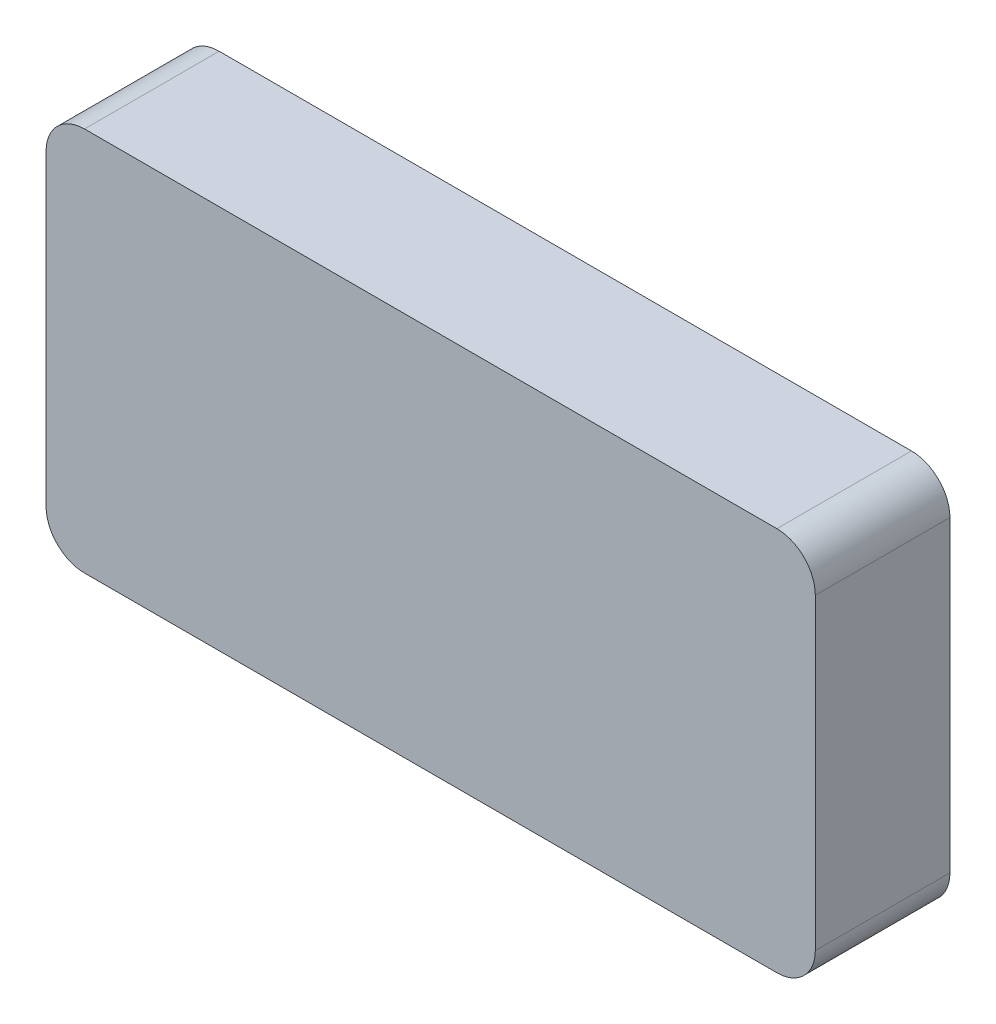
ISO-10303-21;
HEADER;
FILE_DESCRIPTION(('STEP AP214'),'2;1');
FILE_NAME('part.step','',(''),(''),'','','');
FILE_SCHEMA(('AUTOMOTIVE_DESIGN { 1 0 10303 214 1 1 1 1 }'));
ENDSEC;
DATA;
#1=APPLICATION_CONTEXT('core data for automotive mechanical design processes');
#2=APPLICATION_PROTOCOL_DEFINITION('international standard','automotive_design',2000,#1);
#3=PRODUCT_CONTEXT('',#1,'mechanical');
#4=PRODUCT('Part','Part','',(#3));
#5=PRODUCT_RELATED_PRODUCT_CATEGORY('part','',(#4));
#6=PRODUCT_DEFINITION_FORMATION('','',#4);
#7=PRODUCT_DEFINITION_CONTEXT('part definition',#1,'design');
#8=PRODUCT_DEFINITION('design','',#6,#7);
#9=PRODUCT_DEFINITION_SHAPE('','',#8);
#10=(LENGTH_UNIT() NAMED_UNIT(*) SI_UNIT(.MILLI.,.METRE.));
#11=(NAMED_UNIT(*) PLANE_ANGLE_UNIT() SI_UNIT($,.RADIAN.));
#12=(NAMED_UNIT(*) SI_UNIT($,.STERADIAN.) SOLID_ANGLE_UNIT());
#13=UNCERTAINTY_MEASURE_WITH_UNIT(LENGTH_MEASURE(1.E-05),#10,'distance_accuracy_value','');
#14=(GEOMETRIC_REPRESENTATION_CONTEXT(3) GLOBAL_UNCERTAINTY_ASSIGNED_CONTEXT((#13)) GLOBAL_UNIT_ASSIGNED_CONTEXT((#10,
#11,#12)) REPRESENTATION_CONTEXT('',''));
#15=CARTESIAN_POINT('',(0.,0.,0.));
#16=DIRECTION('',(0.,0.,1.));
#17=DIRECTION('',(1.,0.,0.));
#18=AXIS2_PLACEMENT_3D('',#15,#16,#17);
#19=CARTESIAN_POINT('',(9.,4.,3.5));
#20=DIRECTION('',(0.,0.,-1.));
#21=DIRECTION('',(-1.,0.,0.));
#22=AXIS2_PLACEMENT_3D('',#19,#20,#21);
#23=CYLINDRICAL_SURFACE('',#22,1.);
#24=CARTESIAN_POINT('',(9.,4.,0.));
#25=DIRECTION('',(0.,0.,1.));
#26=DIRECTION('',(-1.,0.,0.));
#27=AXIS2_PLACEMENT_3D('',#24,#25,#26);
#28=CIRCLE('',#27,1.);
#29=CARTESIAN_POINT('',(10.,3.99999999999999,0.));
#30=VERTEX_POINT('',#29);
#31=CARTESIAN_POINT('',(8.99999999999999,5.,0.));
#32=VERTEX_POINT('',#31);
#33=EDGE_CURVE('E144',#30,#32,#28,.T.);
#34=ORIENTED_EDGE('',*,*,#33,.T.);
#35=DIRECTION('',(0.,0.,-1.));
#36=VECTOR('',#35,1.);
#37=CARTESIAN_POINT('',(8.99999999999999,5.,3.5));
#38=LINE('',#37,#36);
#39=CARTESIAN_POINT('',(8.99999999999999,5.,3.5));
#40=VERTEX_POINT('',#39);
#41=EDGE_CURVE('E11',#40,#32,#38,.T.);
#42=ORIENTED_EDGE('',*,*,#41,.F.);
#43=CARTESIAN_POINT('',(9.,4.,3.5));
#44=DIRECTION('',(0.,0.,1.));
#45=DIRECTION('',(-1.,0.,0.));
#46=AXIS2_PLACEMENT_3D('',#43,#44,#45);
#47=CIRCLE('',#46,1.);
#48=CARTESIAN_POINT('',(10.,3.99999999999999,3.5));
#49=VERTEX_POINT('',#48);
#50=EDGE_CURVE('E160',#49,#40,#47,.T.);
#51=ORIENTED_EDGE('',*,*,#50,.F.);
#52=DIRECTION('',(0.,0.,-1.));
#53=VECTOR('',#52,1.);
#54=CARTESIAN_POINT('',(10.,3.99999999999999,3.5));
#55=LINE('',#54,#53);
#56=EDGE_CURVE('E140',#49,#30,#55,.T.);
#57=ORIENTED_EDGE('',*,*,#56,.T.);
#58=EDGE_LOOP('',(#34,#42,#51,#57));
#59=FACE_BOUND('',#58,.T.);
#60=ADVANCED_FACE('F36',(#59),#23,.T.);
#61=CARTESIAN_POINT('',(-8.99999999999999,5.,3.5));
#62=DIRECTION('',(0.,-1.,0.));
#63=DIRECTION('',(0.,0.,-1.));
#64=AXIS2_PLACEMENT_3D('',#61,#62,#63);
#65=PLANE('',#64);
#66=DIRECTION('',(-1.,0.,0.));
#67=VECTOR('',#66,1.);
#68=CARTESIAN_POINT('',(-8.99999999999999,5.,0.));
#69=LINE('',#68,#67);
#70=CARTESIAN_POINT('',(-8.99999999999999,5.,0.));
#71=VERTEX_POINT('',#70);
#72=EDGE_CURVE('E147',#32,#71,#69,.T.);
#73=ORIENTED_EDGE('',*,*,#72,.T.);
#74=DIRECTION('',(0.,0.,-1.));
#75=VECTOR('',#74,1.);
#76=CARTESIAN_POINT('',(-8.99999999999999,5.,3.5));
#77=LINE('',#76,#75);
#78=CARTESIAN_POINT('',(-8.99999999999999,5.,3.5));
#79=VERTEX_POINT('',#78);
#80=EDGE_CURVE('E43',#79,#71,#77,.T.);
#81=ORIENTED_EDGE('',*,*,#80,.F.);
#82=DIRECTION('',(-1.,0.,0.));
#83=VECTOR('',#82,1.);
#84=CARTESIAN_POINT('',(-8.99999999999999,5.,3.5));
#85=LINE('',#84,#83);
#86=EDGE_CURVE('E100',#40,#79,#85,.T.);
#87=ORIENTED_EDGE('',*,*,#86,.F.);
#88=ORIENTED_EDGE('',*,*,#41,.T.);
#89=EDGE_LOOP('',(#73,#81,#87,#88));
#90=FACE_BOUND('',#89,.T.);
#91=ADVANCED_FACE('F263',(#90),#65,.F.);
#92=CARTESIAN_POINT('',(-9.,4.,3.5));
#93=DIRECTION('',(0.,0.,-1.));
#94=DIRECTION('',(-1.,0.,0.));
#95=AXIS2_PLACEMENT_3D('',#92,#93,#94);
#96=CYLINDRICAL_SURFACE('',#95,1.);
#97=CARTESIAN_POINT('',(-9.,4.,0.));
#98=DIRECTION('',(0.,0.,1.));
#99=DIRECTION('',(1.,0.,0.));
#100=AXIS2_PLACEMENT_3D('',#97,#98,#99);
#101=CIRCLE('',#100,1.);
#102=CARTESIAN_POINT('',(-10.,3.99999999999999,0.));
#103=VERTEX_POINT('',#102);
#104=EDGE_CURVE('E150',#71,#103,#101,.T.);
#105=ORIENTED_EDGE('',*,*,#104,.T.);
#106=DIRECTION('',(0.,0.,-1.));
#107=VECTOR('',#106,1.);
#108=CARTESIAN_POINT('',(-10.,3.99999999999999,3.5));
#109=LINE('',#108,#107);
#110=CARTESIAN_POINT('',(-10.,3.99999999999999,3.5));
#111=VERTEX_POINT('',#110);
#112=EDGE_CURVE('E167',#111,#103,#109,.T.);
#113=ORIENTED_EDGE('',*,*,#112,.F.);
#114=CARTESIAN_POINT('',(-9.,4.,3.5));
#115=DIRECTION('',(0.,0.,1.));
#116=DIRECTION('',(1.,0.,0.));
#117=AXIS2_PLACEMENT_3D('',#114,#115,#116);
#118=CIRCLE('',#117,1.);
#119=EDGE_CURVE('E175',#79,#111,#118,.T.);
#120=ORIENTED_EDGE('',*,*,#119,.F.);
#121=ORIENTED_EDGE('',*,*,#80,.T.);
#122=EDGE_LOOP('',(#105,#113,#120,#121));
#123=FACE_BOUND('',#122,.T.);
#124=ADVANCED_FACE('F173',(#123),#96,.T.);
#125=CARTESIAN_POINT('',(-10.,3.99999999999999,3.5));
#126=DIRECTION('',(1.,0.,0.));
#127=DIRECTION('',(0.,0.,-1.));
#128=AXIS2_PLACEMENT_3D('',#125,#126,#127);
#129=PLANE('',#128);
#130=DIRECTION('',(0.,-1.,0.));
#131=VECTOR('',#130,1.);
#132=CARTESIAN_POINT('',(-10.,3.99999999999999,0.));
#133=LINE('',#132,#131);
#134=CARTESIAN_POINT('',(-10.,-3.99999999999999,0.));
#135=VERTEX_POINT('',#134);
#136=EDGE_CURVE('E152',#103,#135,#133,.T.);
#137=ORIENTED_EDGE('',*,*,#136,.T.);
#138=DIRECTION('',(0.,0.,-1.));
#139=VECTOR('',#138,1.);
#140=CARTESIAN_POINT('',(-10.,-3.99999999999999,3.5));
#141=LINE('',#140,#139);
#142=CARTESIAN_POINT('',(-10.,-3.99999999999999,3.5));
#143=VERTEX_POINT('',#142);
#144=EDGE_CURVE('E164',#143,#135,#141,.T.);
#145=ORIENTED_EDGE('',*,*,#144,.F.);
#146=DIRECTION('',(0.,-1.,0.));
#147=VECTOR('',#146,1.);
#148=CARTESIAN_POINT('',(-10.,3.99999999999999,3.5));
#149=LINE('',#148,#147);
#150=EDGE_CURVE('E187',#111,#143,#149,.T.);
#151=ORIENTED_EDGE('',*,*,#150,.F.);
#152=ORIENTED_EDGE('',*,*,#112,.T.);
#153=EDGE_LOOP('',(#137,#145,#151,#152));
#154=FACE_BOUND('',#153,.T.);
#155=ADVANCED_FACE('F183',(#154),#129,.F.);
#156=CARTESIAN_POINT('',(-9.,-4.,3.5));
#157=DIRECTION('',(0.,0.,-1.));
#158=DIRECTION('',(-1.,0.,0.));
#159=AXIS2_PLACEMENT_3D('',#156,#157,#158);
#160=CYLINDRICAL_SURFACE('',#159,1.);
#161=CARTESIAN_POINT('',(-9.,-4.,0.));
#162=DIRECTION('',(0.,0.,1.));
#163=DIRECTION('',(1.,0.,0.));
#164=AXIS2_PLACEMENT_3D('',#161,#162,#163);
#165=CIRCLE('',#164,1.);
#166=CARTESIAN_POINT('',(-8.99999999999999,-5.,0.));
#167=VERTEX_POINT('',#166);
#168=EDGE_CURVE('E154',#135,#167,#165,.T.);
#169=ORIENTED_EDGE('',*,*,#168,.T.);
#170=DIRECTION('',(0.,0.,-1.));
#171=VECTOR('',#170,1.);
#172=CARTESIAN_POINT('',(-8.99999999999999,-5.,3.5));
#173=LINE('',#172,#171);
#174=CARTESIAN_POINT('',(-8.99999999999999,-5.,3.5));
#175=VERTEX_POINT('',#174);
#176=EDGE_CURVE('E135',#175,#167,#173,.T.);
#177=ORIENTED_EDGE('',*,*,#176,.F.);
#178=CARTESIAN_POINT('',(-9.,-4.,3.5));
#179=DIRECTION('',(0.,0.,1.));
#180=DIRECTION('',(1.,0.,0.));
#181=AXIS2_PLACEMENT_3D('',#178,#179,#180);
#182=CIRCLE('',#181,1.);
#183=EDGE_CURVE('E123',#143,#175,#182,.T.);
#184=ORIENTED_EDGE('',*,*,#183,.F.);
#185=ORIENTED_EDGE('',*,*,#144,.T.);
#186=EDGE_LOOP('',(#169,#177,#184,#185));
#187=FACE_BOUND('',#186,.T.);
#188=ADVANCED_FACE('F186',(#187),#160,.T.);
#189=CARTESIAN_POINT('',(-8.99999999999999,-5.,3.5));
#190=DIRECTION('',(0.,1.,0.));
#191=DIRECTION('',(0.,0.,1.));
#192=AXIS2_PLACEMENT_3D('',#189,#190,#191);
#193=PLANE('',#192);
#194=DIRECTION('',(1.,0.,0.));
#195=VECTOR('',#194,1.);
#196=CARTESIAN_POINT('',(-8.99999999999999,-5.,0.));
#197=LINE('',#196,#195);
#198=CARTESIAN_POINT('',(8.99999999999999,-5.,0.));
#199=VERTEX_POINT('',#198);
#200=EDGE_CURVE('E132',#167,#199,#197,.T.);
#201=ORIENTED_EDGE('',*,*,#200,.T.);
#202=DIRECTION('',(0.,0.,-1.));
#203=VECTOR('',#202,1.);
#204=CARTESIAN_POINT('',(8.99999999999999,-5.,3.5));
#205=LINE('',#204,#203);
#206=CARTESIAN_POINT('',(8.99999999999999,-5.,3.5));
#207=VERTEX_POINT('',#206);
#208=EDGE_CURVE('E129',#207,#199,#205,.T.);
#209=ORIENTED_EDGE('',*,*,#208,.F.);
#210=DIRECTION('',(1.,0.,0.));
#211=VECTOR('',#210,1.);
#212=CARTESIAN_POINT('',(-8.99999999999999,-5.,3.5));
#213=LINE('',#212,#211);
#214=EDGE_CURVE('E116',#175,#207,#213,.T.);
#215=ORIENTED_EDGE('',*,*,#214,.F.);
#216=ORIENTED_EDGE('',*,*,#176,.T.);
#217=EDGE_LOOP('',(#201,#209,#215,#216));
#218=FACE_BOUND('',#217,.T.);
#219=ADVANCED_FACE('F130',(#218),#193,.F.);
#220=CARTESIAN_POINT('',(9.,-4.,3.5));
#221=DIRECTION('',(0.,0.,-1.));
#222=DIRECTION('',(-1.,0.,0.));
#223=AXIS2_PLACEMENT_3D('',#220,#221,#222);
#224=CYLINDRICAL_SURFACE('',#223,1.);
#225=CARTESIAN_POINT('',(9.,-4.,0.));
#226=DIRECTION('',(0.,0.,1.));
#227=DIRECTION('',(1.,0.,0.));
#228=AXIS2_PLACEMENT_3D('',#225,#226,#227);
#229=CIRCLE('',#228,1.);
#230=CARTESIAN_POINT('',(10.,-4.,0.));
#231=VERTEX_POINT('',#230);
#232=EDGE_CURVE('E157',#199,#231,#229,.T.);
#233=ORIENTED_EDGE('',*,*,#232,.T.);
#234=DIRECTION('',(0.,0.,-1.));
#235=VECTOR('',#234,1.);
#236=CARTESIAN_POINT('',(10.,-4.,3.5));
#237=LINE('',#236,#235);
#238=CARTESIAN_POINT('',(10.,-4.,3.5));
#239=VERTEX_POINT('',#238);
#240=EDGE_CURVE('E136',#239,#231,#237,.T.);
#241=ORIENTED_EDGE('',*,*,#240,.F.);
#242=CARTESIAN_POINT('',(9.,-4.,3.5));
#243=DIRECTION('',(0.,0.,1.));
#244=DIRECTION('',(1.,0.,0.));
#245=AXIS2_PLACEMENT_3D('',#242,#243,#244);
#246=CIRCLE('',#245,1.);
#247=EDGE_CURVE('E120',#207,#239,#246,.T.);
#248=ORIENTED_EDGE('',*,*,#247,.F.);
#249=ORIENTED_EDGE('',*,*,#208,.T.);
#250=EDGE_LOOP('',(#233,#241,#248,#249));
#251=FACE_BOUND('',#250,.T.);
#252=ADVANCED_FACE('F138',(#251),#224,.T.);
#253=CARTESIAN_POINT('',(10.,3.99999999999999,3.5));
#254=DIRECTION('',(-1.,0.,0.));
#255=DIRECTION('',(0.,0.,1.));
#256=AXIS2_PLACEMENT_3D('',#253,#254,#255);
#257=PLANE('',#256);
#258=DIRECTION('',(0.,1.,0.));
#259=VECTOR('',#258,1.);
#260=CARTESIAN_POINT('',(10.,3.99999999999999,0.));
#261=LINE('',#260,#259);
#262=EDGE_CURVE('E92',#231,#30,#261,.T.);
#263=ORIENTED_EDGE('',*,*,#262,.T.);
#264=ORIENTED_EDGE('',*,*,#56,.F.);
#265=DIRECTION('',(0.,1.,0.));
#266=VECTOR('',#265,1.);
#267=CARTESIAN_POINT('',(10.,3.99999999999999,3.5));
#268=LINE('',#267,#266);
#269=EDGE_CURVE('E59',#239,#49,#268,.T.);
#270=ORIENTED_EDGE('',*,*,#269,.F.);
#271=ORIENTED_EDGE('',*,*,#240,.T.);
#272=EDGE_LOOP('',(#263,#264,#270,#271));
#273=FACE_BOUND('',#272,.T.);
#274=ADVANCED_FACE('F270',(#273),#257,.F.);
#275=CARTESIAN_POINT('',(9.,4.,3.5));
#276=DIRECTION('',(0.,0.,-1.));
#277=DIRECTION('',(-1.,0.,0.));
#278=AXIS2_PLACEMENT_3D('',#275,#276,#277);
#279=PLANE('',#278);
#280=ORIENTED_EDGE('',*,*,#50,.T.);
#281=ORIENTED_EDGE('',*,*,#86,.T.);
#282=ORIENTED_EDGE('',*,*,#119,.T.);
#283=ORIENTED_EDGE('',*,*,#150,.T.);
#284=ORIENTED_EDGE('',*,*,#183,.T.);
#285=ORIENTED_EDGE('',*,*,#214,.T.);
#286=ORIENTED_EDGE('',*,*,#247,.T.);
#287=ORIENTED_EDGE('',*,*,#269,.T.);
#288=EDGE_LOOP('',(#280,#281,#282,#283,#284,#285,#286,#287));
#289=FACE_BOUND('',#288,.T.);
#290=ADVANCED_FACE('F118',(#289),#279,.F.);
#291=CARTESIAN_POINT('',(9.,4.,0.));
#292=DIRECTION('',(0.,0.,-1.));
#293=DIRECTION('',(-1.,0.,0.));
#294=AXIS2_PLACEMENT_3D('',#291,#292,#293);
#295=PLANE('',#294);
#296=DIRECTION('',(0.,-1.,0.));
#297=VECTOR('',#296,1.);
#298=CARTESIAN_POINT('',(9.,4.,0.));
#299=LINE('',#298,#297);
#300=CARTESIAN_POINT('',(9.,4.,0.));
#301=VERTEX_POINT('',#300);
#302=CARTESIAN_POINT('',(9.,-4.,0.));
#303=VERTEX_POINT('',#302);
#304=EDGE_CURVE('E50',#301,#303,#299,.T.);
#305=ORIENTED_EDGE('',*,*,#304,.F.);
#306=DIRECTION('',(1.,0.,0.));
#307=VECTOR('',#306,1.);
#308=CARTESIAN_POINT('',(9.,4.,0.));
#309=LINE('',#308,#307);
#310=CARTESIAN_POINT('',(-9.,4.,0.));
#311=VERTEX_POINT('',#310);
#312=EDGE_CURVE('E203',#311,#301,#309,.T.);
#313=ORIENTED_EDGE('',*,*,#312,.F.);
#314=DIRECTION('',(0.,1.,0.));
#315=VECTOR('',#314,1.);
#316=CARTESIAN_POINT('',(-9.,4.,0.));
#317=LINE('',#316,#315);
#318=CARTESIAN_POINT('',(-9.,-4.,0.));
#319=VERTEX_POINT('',#318);
#320=EDGE_CURVE('E207',#319,#311,#317,.T.);
#321=ORIENTED_EDGE('',*,*,#320,.F.);
#322=DIRECTION('',(-1.,0.,0.));
#323=VECTOR('',#322,1.);
#324=CARTESIAN_POINT('',(9.,-4.,0.));
#325=LINE('',#324,#323);
#326=EDGE_CURVE('E210',#303,#319,#325,.T.);
#327=ORIENTED_EDGE('',*,*,#326,.F.);
#328=EDGE_LOOP('',(#305,#313,#321,#327));
#329=FACE_BOUND('',#328,.T.);
#330=ORIENTED_EDGE('',*,*,#33,.F.);
#331=ORIENTED_EDGE('',*,*,#262,.F.);
#332=ORIENTED_EDGE('',*,*,#232,.F.);
#333=ORIENTED_EDGE('',*,*,#200,.F.);
#334=ORIENTED_EDGE('',*,*,#168,.F.);
#335=ORIENTED_EDGE('',*,*,#136,.F.);
#336=ORIENTED_EDGE('',*,*,#104,.F.);
#337=ORIENTED_EDGE('',*,*,#72,.F.);
#338=EDGE_LOOP('',(#330,#331,#332,#333,#334,#335,#336,#337));
#339=FACE_BOUND('',#338,.T.);
#340=ADVANCED_FACE('F179',(#329,#339),#295,.T.);
#341=CARTESIAN_POINT('',(9.,4.,1.));
#342=DIRECTION('',(1.,0.,0.));
#343=DIRECTION('',(0.,0.,-1.));
#344=AXIS2_PLACEMENT_3D('',#341,#342,#343);
#345=PLANE('',#344);
#346=ORIENTED_EDGE('',*,*,#304,.T.);
#347=DIRECTION('',(0.,0.,-1.));
#348=VECTOR('',#347,1.);
#349=CARTESIAN_POINT('',(9.,-4.,1.));
#350=LINE('',#349,#348);
#351=CARTESIAN_POINT('',(9.,-4.,1.));
#352=VERTEX_POINT('',#351);
#353=EDGE_CURVE('E193',#352,#303,#350,.T.);
#354=ORIENTED_EDGE('',*,*,#353,.F.);
#355=DIRECTION('',(0.,-1.,0.));
#356=VECTOR('',#355,1.);
#357=CARTESIAN_POINT('',(9.,4.,1.));
#358=LINE('',#357,#356);
#359=CARTESIAN_POINT('',(9.,4.,1.));
#360=VERTEX_POINT('',#359);
#361=EDGE_CURVE('E206',#360,#352,#358,.T.);
#362=ORIENTED_EDGE('',*,*,#361,.F.);
#363=DIRECTION('',(0.,0.,-1.));
#364=VECTOR('',#363,1.);
#365=CARTESIAN_POINT('',(9.,4.,1.));
#366=LINE('',#365,#364);
#367=EDGE_CURVE('E148',#360,#301,#366,.T.);
#368=ORIENTED_EDGE('',*,*,#367,.T.);
#369=EDGE_LOOP('',(#346,#354,#362,#368));
#370=FACE_BOUND('',#369,.T.);
#371=ADVANCED_FACE('F231',(#370),#345,.F.);
#372=CARTESIAN_POINT('',(9.,4.,1.));
#373=DIRECTION('',(0.,1.,0.));
#374=DIRECTION('',(0.,0.,1.));
#375=AXIS2_PLACEMENT_3D('',#372,#373,#374);
#376=PLANE('',#375);
#377=ORIENTED_EDGE('',*,*,#312,.T.);
#378=ORIENTED_EDGE('',*,*,#367,.F.);
#379=DIRECTION('',(1.,0.,0.));
#380=VECTOR('',#379,1.);
#381=CARTESIAN_POINT('',(9.,4.,1.));
#382=LINE('',#381,#380);
#383=CARTESIAN_POINT('',(-9.,4.,1.));
#384=VERTEX_POINT('',#383);
#385=EDGE_CURVE('E196',#384,#360,#382,.T.);
#386=ORIENTED_EDGE('',*,*,#385,.F.);
#387=DIRECTION('',(0.,0.,-1.));
#388=VECTOR('',#387,1.);
#389=CARTESIAN_POINT('',(-9.,4.,1.));
#390=LINE('',#389,#388);
#391=EDGE_CURVE('E199',#384,#311,#390,.T.);
#392=ORIENTED_EDGE('',*,*,#391,.T.);
#393=EDGE_LOOP('',(#377,#378,#386,#392));
#394=FACE_BOUND('',#393,.T.);
#395=ADVANCED_FACE('F242',(#394),#376,.F.);
#396=CARTESIAN_POINT('',(-9.,4.,1.));
#397=DIRECTION('',(-1.,0.,0.));
#398=DIRECTION('',(0.,0.,1.));
#399=AXIS2_PLACEMENT_3D('',#396,#397,#398);
#400=PLANE('',#399);
#401=ORIENTED_EDGE('',*,*,#320,.T.);
#402=ORIENTED_EDGE('',*,*,#391,.F.);
#403=DIRECTION('',(0.,1.,0.));
#404=VECTOR('',#403,1.);
#405=CARTESIAN_POINT('',(-9.,4.,1.));
#406=LINE('',#405,#404);
#407=CARTESIAN_POINT('',(-9.,-4.,1.));
#408=VERTEX_POINT('',#407);
#409=EDGE_CURVE('E216',#408,#384,#406,.T.);
#410=ORIENTED_EDGE('',*,*,#409,.F.);
#411=DIRECTION('',(0.,0.,-1.));
#412=VECTOR('',#411,1.);
#413=CARTESIAN_POINT('',(-9.,-4.,1.));
#414=LINE('',#413,#412);
#415=EDGE_CURVE('E195',#408,#319,#414,.T.);
#416=ORIENTED_EDGE('',*,*,#415,.T.);
#417=EDGE_LOOP('',(#401,#402,#410,#416));
#418=FACE_BOUND('',#417,.T.);
#419=ADVANCED_FACE('F247',(#418),#400,.F.);
#420=CARTESIAN_POINT('',(9.,-4.,1.));
#421=DIRECTION('',(0.,-1.,0.));
#422=DIRECTION('',(0.,0.,-1.));
#423=AXIS2_PLACEMENT_3D('',#420,#421,#422);
#424=PLANE('',#423);
#425=ORIENTED_EDGE('',*,*,#326,.T.);
#426=ORIENTED_EDGE('',*,*,#415,.F.);
#427=DIRECTION('',(-1.,0.,0.));
#428=VECTOR('',#427,1.);
#429=CARTESIAN_POINT('',(9.,-4.,1.));
#430=LINE('',#429,#428);
#431=EDGE_CURVE('E219',#352,#408,#430,.T.);
#432=ORIENTED_EDGE('',*,*,#431,.F.);
#433=ORIENTED_EDGE('',*,*,#353,.T.);
#434=EDGE_LOOP('',(#425,#426,#432,#433));
#435=FACE_BOUND('',#434,.T.);
#436=ADVANCED_FACE('F252',(#435),#424,.F.);
#437=CARTESIAN_POINT('',(0.,0.,1.));
#438=DIRECTION('',(0.,0.,-1.));
#439=DIRECTION('',(-1.,0.,0.));
#440=AXIS2_PLACEMENT_3D('',#437,#438,#439);
#441=PLANE('',#440);
#442=ORIENTED_EDGE('',*,*,#361,.T.);
#443=ORIENTED_EDGE('',*,*,#431,.T.);
#444=ORIENTED_EDGE('',*,*,#409,.T.);
#445=ORIENTED_EDGE('',*,*,#385,.T.);
#446=EDGE_LOOP('',(#442,#443,#444,#445));
#447=FACE_BOUND('',#446,.T.);
#448=ADVANCED_FACE('F226',(#447),#441,.T.);
#449=CLOSED_SHELL('',(#60,#91,#124,#155,#188,#219,#252,#274,#290,#340,#371,#395,#419,#436,#448));
#450=MANIFOLD_SOLID_BREP('B2',#449);
#451=ADVANCED_BREP_SHAPE_REPRESENTATION('',(#18,#450),#14);
#452=SHAPE_DEFINITION_REPRESENTATION(#9,#451);
ENDSEC;
END-ISO-10303-21;
